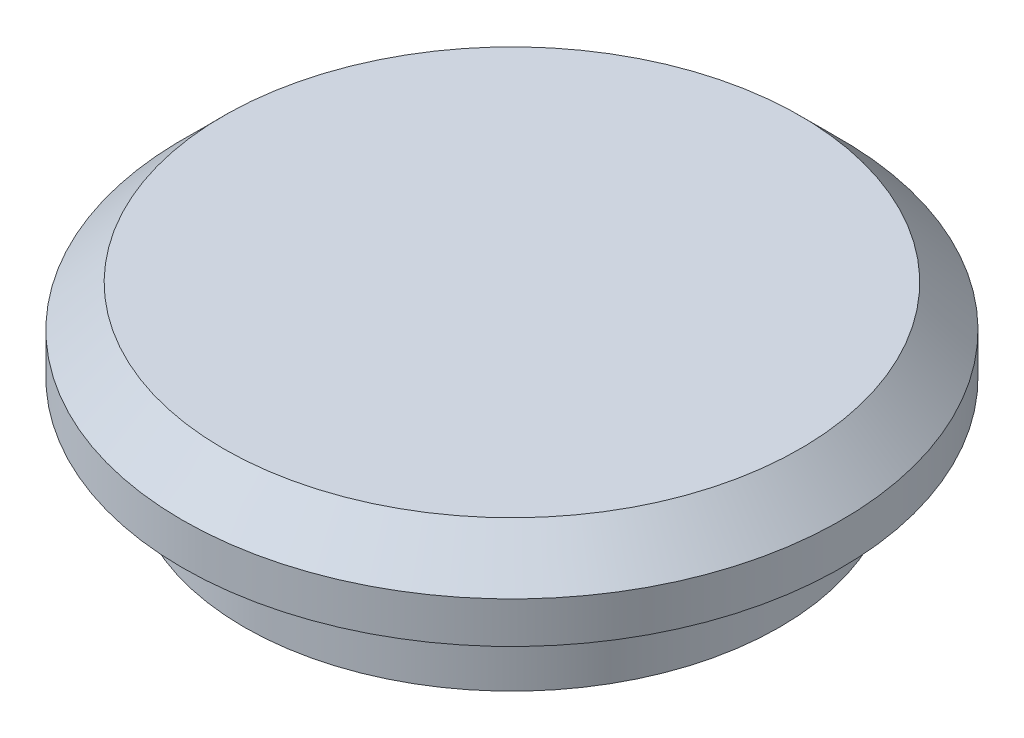
ISO-10303-21;
HEADER;
FILE_DESCRIPTION(('STEP AP214'),'2;1');
FILE_NAME('part.step','',(''),(''),'','','');
FILE_SCHEMA(('AUTOMOTIVE_DESIGN { 1 0 10303 214 1 1 1 1 }'));
ENDSEC;
DATA;
#1=APPLICATION_CONTEXT('core data for automotive mechanical design processes');
#2=APPLICATION_PROTOCOL_DEFINITION('international standard','automotive_design',2000,#1);
#3=PRODUCT_CONTEXT('',#1,'mechanical');
#4=PRODUCT('Part','Part','',(#3));
#5=PRODUCT_RELATED_PRODUCT_CATEGORY('part','',(#4));
#6=PRODUCT_DEFINITION_FORMATION('','',#4);
#7=PRODUCT_DEFINITION_CONTEXT('part definition',#1,'design');
#8=PRODUCT_DEFINITION('design','',#6,#7);
#9=PRODUCT_DEFINITION_SHAPE('','',#8);
#10=(LENGTH_UNIT() NAMED_UNIT(*) SI_UNIT(.MILLI.,.METRE.));
#11=(NAMED_UNIT(*) PLANE_ANGLE_UNIT() SI_UNIT($,.RADIAN.));
#12=(NAMED_UNIT(*) SI_UNIT($,.STERADIAN.) SOLID_ANGLE_UNIT());
#13=UNCERTAINTY_MEASURE_WITH_UNIT(LENGTH_MEASURE(1.E-05),#10,'distance_accuracy_value','');
#14=(GEOMETRIC_REPRESENTATION_CONTEXT(3) GLOBAL_UNCERTAINTY_ASSIGNED_CONTEXT((#13)) GLOBAL_UNIT_ASSIGNED_CONTEXT((#10,
#11,#12)) REPRESENTATION_CONTEXT('',''));
#15=CARTESIAN_POINT('',(0.,0.,0.));
#16=DIRECTION('',(0.,0.,1.));
#17=DIRECTION('',(1.,0.,0.));
#18=AXIS2_PLACEMENT_3D('',#15,#16,#17);
#19=CARTESIAN_POINT('',(0.,4.,0.));
#20=DIRECTION('',(0.,-1.,0.));
#21=DIRECTION('',(0.,0.,-1.));
#22=AXIS2_PLACEMENT_3D('',#19,#20,#21);
#23=CYLINDRICAL_SURFACE('',#22,6.5);
#24=CARTESIAN_POINT('',(0.,0.,0.));
#25=DIRECTION('',(0.,1.,0.));
#26=DIRECTION('',(0.,0.,1.));
#27=AXIS2_PLACEMENT_3D('',#24,#25,#26);
#28=CIRCLE('',#27,6.5);
#29=CARTESIAN_POINT('',(0.,0.,6.5));
#30=VERTEX_POINT('',#29);
#31=EDGE_CURVE('E45',#30,#30,#28,.T.);
#32=ORIENTED_EDGE('',*,*,#31,.T.);
#33=EDGE_LOOP('',(#32));
#34=FACE_BOUND('',#33,.T.);
#35=CARTESIAN_POINT('',(0.,2.,0.));
#36=DIRECTION('',(0.,1.,0.));
#37=DIRECTION('',(0.,0.,1.));
#38=AXIS2_PLACEMENT_3D('',#35,#36,#37);
#39=CIRCLE('',#38,6.5);
#40=CARTESIAN_POINT('',(0.,2.,6.5));
#41=VERTEX_POINT('',#40);
#42=EDGE_CURVE('E41',#41,#41,#39,.T.);
#43=ORIENTED_EDGE('',*,*,#42,.F.);
#44=EDGE_LOOP('',(#43));
#45=FACE_BOUND('',#44,.T.);
#46=ADVANCED_FACE('F30',(#34,#45),#23,.T.);
#47=CARTESIAN_POINT('',(0.,0.,0.));
#48=DIRECTION('',(0.,1.,0.));
#49=DIRECTION('',(0.,0.,1.));
#50=AXIS2_PLACEMENT_3D('',#47,#48,#49);
#51=PLANE('',#50);
#52=ORIENTED_EDGE('',*,*,#31,.F.);
#53=EDGE_LOOP('',(#52));
#54=FACE_BOUND('',#53,.T.);
#55=ADVANCED_FACE('F66',(#54),#51,.F.);
#56=CARTESIAN_POINT('',(0.,2.,0.));
#57=DIRECTION('',(0.,1.,0.));
#58=DIRECTION('',(0.,0.,1.));
#59=AXIS2_PLACEMENT_3D('',#56,#57,#58);
#60=CYLINDRICAL_SURFACE('',#59,8.);
#61=CARTESIAN_POINT('',(0.,2.99999999999999,0.));
#62=DIRECTION('',(0.,1.,0.));
#63=DIRECTION('',(0.,0.,1.));
#64=AXIS2_PLACEMENT_3D('',#61,#62,#63);
#65=CIRCLE('',#64,8.);
#66=CARTESIAN_POINT('',(0.,2.99999999999999,8.));
#67=VERTEX_POINT('',#66);
#68=EDGE_CURVE('E10',#67,#67,#65,.F.);
#69=ORIENTED_EDGE('',*,*,#68,.T.);
#70=EDGE_LOOP('',(#69));
#71=FACE_BOUND('',#70,.T.);
#72=CARTESIAN_POINT('',(0.,2.,0.));
#73=DIRECTION('',(0.,1.,0.));
#74=DIRECTION('',(0.,0.,1.));
#75=AXIS2_PLACEMENT_3D('',#72,#73,#74);
#76=CIRCLE('',#75,8.);
#77=CARTESIAN_POINT('',(0.,2.,8.));
#78=VERTEX_POINT('',#77);
#79=EDGE_CURVE('E50',#78,#78,#76,.T.);
#80=ORIENTED_EDGE('',*,*,#79,.T.);
#81=EDGE_LOOP('',(#80));
#82=FACE_BOUND('',#81,.T.);
#83=ADVANCED_FACE('F54',(#71,#82),#60,.T.);
#84=CARTESIAN_POINT('',(0.,2.,0.));
#85=DIRECTION('',(0.,1.,0.));
#86=DIRECTION('',(0.,0.,1.));
#87=AXIS2_PLACEMENT_3D('',#84,#85,#86);
#88=PLANE('',#87);
#89=ORIENTED_EDGE('',*,*,#42,.T.);
#90=EDGE_LOOP('',(#89));
#91=FACE_BOUND('',#90,.T.);
#92=ORIENTED_EDGE('',*,*,#79,.F.);
#93=EDGE_LOOP('',(#92));
#94=FACE_BOUND('',#93,.T.);
#95=ADVANCED_FACE('F56',(#91,#94),#88,.F.);
#96=CARTESIAN_POINT('',(0.,4.,0.));
#97=DIRECTION('',(0.,1.,0.));
#98=DIRECTION('',(0.,0.,1.));
#99=AXIS2_PLACEMENT_3D('',#96,#97,#98);
#100=PLANE('',#99);
#101=CARTESIAN_POINT('',(0.,4.,0.));
#102=DIRECTION('',(0.,1.,0.));
#103=DIRECTION('',(0.,0.,1.));
#104=AXIS2_PLACEMENT_3D('',#101,#102,#103);
#105=CIRCLE('',#104,7.);
#106=CARTESIAN_POINT('',(0.,4.,7.));
#107=VERTEX_POINT('',#106);
#108=EDGE_CURVE('E37',#107,#107,#105,.T.);
#109=ORIENTED_EDGE('',*,*,#108,.T.);
#110=EDGE_LOOP('',(#109));
#111=FACE_BOUND('',#110,.T.);
#112=ADVANCED_FACE('F58',(#111),#100,.T.);
#113=CARTESIAN_POINT('',(0.,4.,0.));
#114=DIRECTION('',(0.,-1.,0.));
#115=DIRECTION('',(0.,0.,-1.));
#116=AXIS2_PLACEMENT_3D('',#113,#114,#115);
#117=CONICAL_SURFACE('',#116,7.,0.785398163397447);
#118=ORIENTED_EDGE('',*,*,#68,.F.);
#119=EDGE_LOOP('',(#118));
#120=FACE_BOUND('',#119,.T.);
#121=ORIENTED_EDGE('',*,*,#108,.F.);
#122=EDGE_LOOP('',(#121));
#123=FACE_BOUND('',#122,.T.);
#124=ADVANCED_FACE('F32',(#120,#123),#117,.T.);
#125=CLOSED_SHELL('',(#46,#55,#83,#95,#112,#124));
#126=MANIFOLD_SOLID_BREP('B2',#125);
#127=ADVANCED_BREP_SHAPE_REPRESENTATION('',(#18,#126),#14);
#128=SHAPE_DEFINITION_REPRESENTATION(#9,#127);
ENDSEC;
END-ISO-10303-21;
